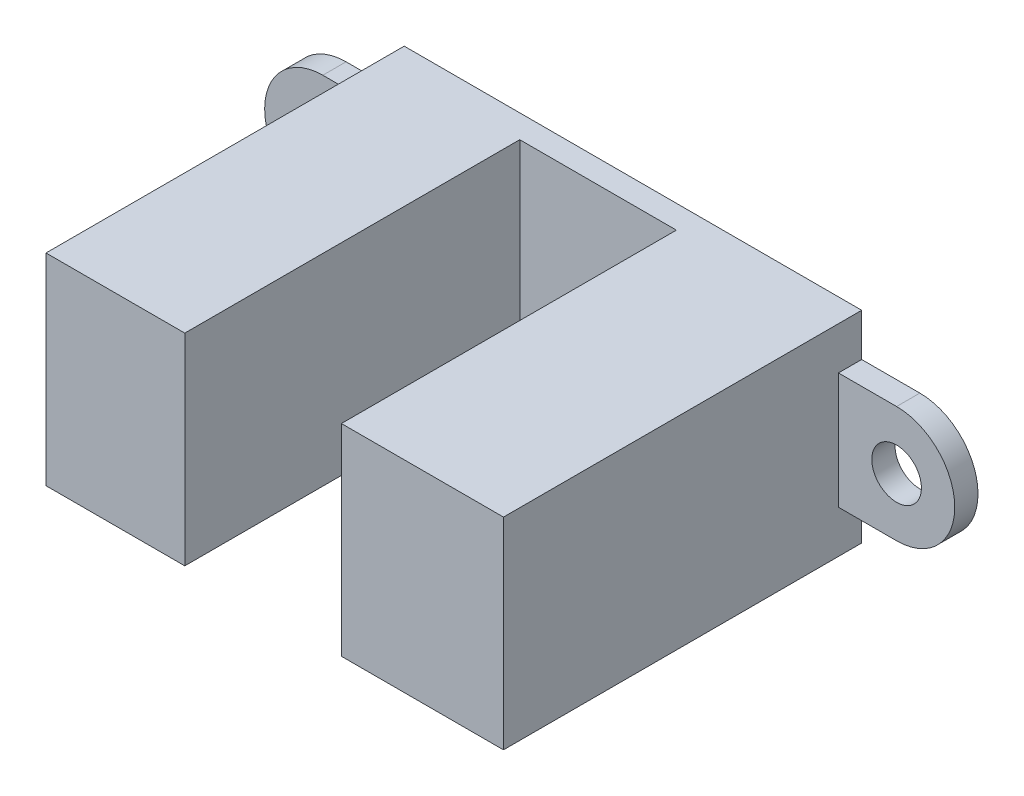
ISO-10303-21;
HEADER;
FILE_DESCRIPTION(('STEP AP214'),'2;1');
FILE_NAME('part.step','',(''),(''),'','','');
FILE_SCHEMA(('AUTOMOTIVE_DESIGN { 1 0 10303 214 1 1 1 1 }'));
ENDSEC;
DATA;
#1=APPLICATION_CONTEXT('core data for automotive mechanical design processes');
#2=APPLICATION_PROTOCOL_DEFINITION('international standard','automotive_design',2000,#1);
#3=PRODUCT_CONTEXT('',#1,'mechanical');
#4=PRODUCT('Part','Part','',(#3));
#5=PRODUCT_RELATED_PRODUCT_CATEGORY('part','',(#4));
#6=PRODUCT_DEFINITION_FORMATION('','',#4);
#7=PRODUCT_DEFINITION_CONTEXT('part definition',#1,'design');
#8=PRODUCT_DEFINITION('design','',#6,#7);
#9=PRODUCT_DEFINITION_SHAPE('','',#8);
#10=(LENGTH_UNIT() NAMED_UNIT(*) SI_UNIT(.MILLI.,.METRE.));
#11=(NAMED_UNIT(*) PLANE_ANGLE_UNIT() SI_UNIT($,.RADIAN.));
#12=(NAMED_UNIT(*) SI_UNIT($,.STERADIAN.) SOLID_ANGLE_UNIT());
#13=UNCERTAINTY_MEASURE_WITH_UNIT(LENGTH_MEASURE(1.E-05),#10,'distance_accuracy_value','');
#14=(GEOMETRIC_REPRESENTATION_CONTEXT(3) GLOBAL_UNCERTAINTY_ASSIGNED_CONTEXT((#13)) GLOBAL_UNIT_ASSIGNED_CONTEXT((#10,
#11,#12)) REPRESENTATION_CONTEXT('',''));
#15=CARTESIAN_POINT('',(0.,0.,0.));
#16=DIRECTION('',(0.,0.,1.));
#17=DIRECTION('',(1.,0.,0.));
#18=AXIS2_PLACEMENT_3D('',#15,#16,#17);
#19=CARTESIAN_POINT('',(0.,0.,1.5));
#20=DIRECTION('',(0.,0.,0.999999999999993));
#21=DIRECTION('',(1.,0.,0.));
#22=AXIS2_PLACEMENT_3D('',#19,#20,#21);
#23=PLANE('',#22);
#24=DIRECTION('',(1.,0.,0.));
#25=VECTOR('',#24,1.);
#26=CARTESIAN_POINT('',(0.,6.49999999999979,1.5));
#27=LINE('',#26,#25);
#28=CARTESIAN_POINT('',(-5.8,6.49999999999979,1.5));
#29=VERTEX_POINT('',#28);
#30=CARTESIAN_POINT('',(4.3,6.49999999999979,1.49999999999997));
#31=VERTEX_POINT('',#30);
#32=EDGE_CURVE('E52',#29,#31,#27,.T.);
#33=ORIENTED_EDGE('',*,*,#32,.F.);
#34=DIRECTION('',(0.,-0.999999999999997,0.));
#35=VECTOR('',#34,1.);
#36=CARTESIAN_POINT('',(-5.8,0.,1.5));
#37=LINE('',#36,#35);
#38=CARTESIAN_POINT('',(-5.8,-6.5,1.49999999999997));
#39=VERTEX_POINT('',#38);
#40=EDGE_CURVE('E157',#29,#39,#37,.T.);
#41=ORIENTED_EDGE('',*,*,#40,.T.);
#42=DIRECTION('',(1.,0.,0.));
#43=VECTOR('',#42,1.);
#44=CARTESIAN_POINT('',(0.,-6.5,1.49999999999997));
#45=LINE('',#44,#43);
#46=CARTESIAN_POINT('',(4.3,-6.5,1.49999999999997));
#47=VERTEX_POINT('',#46);
#48=EDGE_CURVE('E288',#39,#47,#45,.T.);
#49=ORIENTED_EDGE('',*,*,#48,.T.);
#50=DIRECTION('',(0.,0.999999999999997,0.));
#51=VECTOR('',#50,1.);
#52=CARTESIAN_POINT('',(4.3,0.,1.5));
#53=LINE('',#52,#51);
#54=EDGE_CURVE('E175',#47,#31,#53,.T.);
#55=ORIENTED_EDGE('',*,*,#54,.T.);
#56=EDGE_LOOP('',(#33,#41,#49,#55));
#57=FACE_BOUND('',#56,.T.);
#58=ADVANCED_FACE('F36',(#57),#23,.T.);
#59=CARTESIAN_POINT('',(-18.5,0.,1.50000000000003));
#60=DIRECTION('',(0.,0.,0.999999999999993));
#61=DIRECTION('',(1.,0.,0.));
#62=AXIS2_PLACEMENT_3D('',#59,#60,#61);
#63=CIRCLE('',#62,1.6);
#64=CARTESIAN_POINT('',(-20.1,0.,1.50000000000002));
#65=VERTEX_POINT('',#64);
#66=EDGE_CURVE('E264',#65,#65,#63,.T.);
#67=ORIENTED_EDGE('',*,*,#66,.F.);
#68=EDGE_LOOP('',(#67));
#69=FACE_BOUND('',#68,.T.);
#70=DIRECTION('',(0.,-0.999999999999997,0.));
#71=VECTOR('',#70,1.);
#72=CARTESIAN_POINT('',(-14.75,0.,1.5));
#73=LINE('',#72,#71);
#74=CARTESIAN_POINT('',(-14.75,3.74999999999979,1.5));
#75=VERTEX_POINT('',#74);
#76=CARTESIAN_POINT('',(-14.75,-3.75,1.5));
#77=VERTEX_POINT('',#76);
#78=EDGE_CURVE('E262',#75,#77,#73,.T.);
#79=ORIENTED_EDGE('',*,*,#78,.F.);
#80=DIRECTION('',(-1.,0.,0.));
#81=VECTOR('',#80,1.);
#82=CARTESIAN_POINT('',(0.,3.74999999999979,1.5));
#83=LINE('',#82,#81);
#84=CARTESIAN_POINT('',(-18.5,3.74999999999979,1.50000000000003));
#85=VERTEX_POINT('',#84);
#86=EDGE_CURVE('E61',#75,#85,#83,.T.);
#87=ORIENTED_EDGE('',*,*,#86,.T.);
#88=CARTESIAN_POINT('',(-18.5,0.,1.50000000000003));
#89=DIRECTION('',(0.,0.,0.999999999999993));
#90=DIRECTION('',(1.,0.,0.));
#91=AXIS2_PLACEMENT_3D('',#88,#89,#90);
#92=CIRCLE('',#91,3.75);
#93=CARTESIAN_POINT('',(-18.5,-3.75,1.50000000000003));
#94=VERTEX_POINT('',#93);
#95=EDGE_CURVE('E213',#94,#85,#92,.F.);
#96=ORIENTED_EDGE('',*,*,#95,.F.);
#97=DIRECTION('',(-1.,0.,0.));
#98=VECTOR('',#97,1.);
#99=CARTESIAN_POINT('',(0.,-3.75,1.5));
#100=LINE('',#99,#98);
#101=EDGE_CURVE('E244',#77,#94,#100,.T.);
#102=ORIENTED_EDGE('',*,*,#101,.F.);
#103=EDGE_LOOP('',(#79,#87,#96,#102));
#104=FACE_BOUND('',#103,.T.);
#105=ADVANCED_FACE('F327',(#69,#104),#23,.T.);
#106=CARTESIAN_POINT('',(-18.5,0.,1.50000000000003));
#107=DIRECTION('',(0.,0.,-0.999999999999993));
#108=DIRECTION('',(-1.,0.,0.));
#109=AXIS2_PLACEMENT_3D('',#106,#107,#108);
#110=CYLINDRICAL_SURFACE('',#109,3.75);
#111=CARTESIAN_POINT('',(-18.5,0.,0.));
#112=DIRECTION('',(0.,0.,0.999999999999993));
#113=DIRECTION('',(1.,0.,0.));
#114=AXIS2_PLACEMENT_3D('',#111,#112,#113);
#115=CIRCLE('',#114,3.75);
#116=CARTESIAN_POINT('',(-18.5,-3.75,0.));
#117=VERTEX_POINT('',#116);
#118=CARTESIAN_POINT('',(-18.5,3.74999999999979,0.));
#119=VERTEX_POINT('',#118);
#120=EDGE_CURVE('E184',#117,#119,#115,.F.);
#121=ORIENTED_EDGE('',*,*,#120,.F.);
#122=DIRECTION('',(0.,0.,-0.999999999999993));
#123=VECTOR('',#122,1.);
#124=CARTESIAN_POINT('',(-18.5,-3.75,1.50000000000003));
#125=LINE('',#124,#123);
#126=EDGE_CURVE('E40',#94,#117,#125,.T.);
#127=ORIENTED_EDGE('',*,*,#126,.F.);
#128=ORIENTED_EDGE('',*,*,#95,.T.);
#129=DIRECTION('',(0.,0.,-0.999999999999993));
#130=VECTOR('',#129,1.);
#131=CARTESIAN_POINT('',(-18.5,3.74999999999979,1.50000000000003));
#132=LINE('',#131,#130);
#133=EDGE_CURVE('E107',#85,#119,#132,.T.);
#134=ORIENTED_EDGE('',*,*,#133,.T.);
#135=EDGE_LOOP('',(#121,#127,#128,#134));
#136=FACE_BOUND('',#135,.T.);
#137=ADVANCED_FACE('F38',(#136),#110,.T.);
#138=CARTESIAN_POINT('',(0.,-3.75,1.5));
#139=DIRECTION('',(0.,-0.999999999999997,0.));
#140=DIRECTION('',(0.,0.,-0.999999999999993));
#141=AXIS2_PLACEMENT_3D('',#138,#139,#140);
#142=PLANE('',#141);
#143=DIRECTION('',(-1.,0.,0.));
#144=VECTOR('',#143,1.);
#145=CARTESIAN_POINT('',(0.,-3.75,0.));
#146=LINE('',#145,#144);
#147=CARTESIAN_POINT('',(-14.75,-3.75,0.));
#148=VERTEX_POINT('',#147);
#149=EDGE_CURVE('E187',#148,#117,#146,.T.);
#150=ORIENTED_EDGE('',*,*,#149,.F.);
#151=DIRECTION('',(0.,0.,-0.999999999999993));
#152=VECTOR('',#151,1.);
#153=CARTESIAN_POINT('',(-14.75,-3.75,1.5));
#154=LINE('',#153,#152);
#155=EDGE_CURVE('E235',#77,#148,#154,.T.);
#156=ORIENTED_EDGE('',*,*,#155,.F.);
#157=ORIENTED_EDGE('',*,*,#101,.T.);
#158=ORIENTED_EDGE('',*,*,#126,.T.);
#159=EDGE_LOOP('',(#150,#156,#157,#158));
#160=FACE_BOUND('',#159,.T.);
#161=ADVANCED_FACE('F242',(#160),#142,.T.);
#162=CARTESIAN_POINT('',(0.,-6.5,1.49999999999997));
#163=DIRECTION('',(0.,0.999999999999997,0.));
#164=DIRECTION('',(0.,0.,0.999999999999993));
#165=AXIS2_PLACEMENT_3D('',#162,#163,#164);
#166=PLANE('',#165);
#167=DIRECTION('',(1.,0.,0.));
#168=VECTOR('',#167,1.);
#169=CARTESIAN_POINT('',(0.,-6.5,0.));
#170=LINE('',#169,#168);
#171=CARTESIAN_POINT('',(-14.75,-6.5,0.));
#172=VERTEX_POINT('',#171);
#173=CARTESIAN_POINT('',(14.75,-6.5,0.));
#174=VERTEX_POINT('',#173);
#175=EDGE_CURVE('E194',#172,#174,#170,.T.);
#176=ORIENTED_EDGE('',*,*,#175,.T.);
#177=DIRECTION('',(0.,0.,-0.999999999999993));
#178=VECTOR('',#177,1.);
#179=CARTESIAN_POINT('',(14.75,-6.5,1.49999999999995));
#180=LINE('',#179,#178);
#181=CARTESIAN_POINT('',(14.75,-6.50000000000001,23.0999999999998));
#182=VERTEX_POINT('',#181);
#183=EDGE_CURVE('E231',#182,#174,#180,.T.);
#184=ORIENTED_EDGE('',*,*,#183,.F.);
#185=DIRECTION('',(1.,0.,0.));
#186=VECTOR('',#185,1.);
#187=CARTESIAN_POINT('',(4.29999999999999,-6.50000000000001,23.0999999999999));
#188=LINE('',#187,#186);
#189=CARTESIAN_POINT('',(4.29999999999999,-6.50000000000001,23.0999999999999));
#190=VERTEX_POINT('',#189);
#191=EDGE_CURVE('E188',#190,#182,#188,.T.);
#192=ORIENTED_EDGE('',*,*,#191,.F.);
#193=DIRECTION('',(0.,0.,-0.999999999999993));
#194=VECTOR('',#193,1.);
#195=CARTESIAN_POINT('',(4.3,-6.5,1.49999999999997));
#196=LINE('',#195,#194);
#197=EDGE_CURVE('E270',#190,#47,#196,.T.);
#198=ORIENTED_EDGE('',*,*,#197,.T.);
#199=ORIENTED_EDGE('',*,*,#48,.F.);
#200=DIRECTION('',(0.,0.,0.999999999999993));
#201=VECTOR('',#200,1.);
#202=CARTESIAN_POINT('',(-5.8,-6.5,1.49999999999997));
#203=LINE('',#202,#201);
#204=CARTESIAN_POINT('',(-5.80000000000001,-6.50000000000001,23.0999999999999));
#205=VERTEX_POINT('',#204);
#206=EDGE_CURVE('E163',#39,#205,#203,.T.);
#207=ORIENTED_EDGE('',*,*,#206,.T.);
#208=DIRECTION('',(-1.,0.,0.));
#209=VECTOR('',#208,1.);
#210=CARTESIAN_POINT('',(-5.80000000000001,-6.50000000000001,23.0999999999999));
#211=LINE('',#210,#209);
#212=CARTESIAN_POINT('',(-14.75,-6.50000000000001,23.0999999999999));
#213=VERTEX_POINT('',#212);
#214=EDGE_CURVE('E256',#205,#213,#211,.T.);
#215=ORIENTED_EDGE('',*,*,#214,.T.);
#216=DIRECTION('',(0.,0.,-0.999999999999993));
#217=VECTOR('',#216,1.);
#218=CARTESIAN_POINT('',(-14.75,-6.5,1.5));
#219=LINE('',#218,#217);
#220=EDGE_CURVE('E234',#213,#172,#219,.T.);
#221=ORIENTED_EDGE('',*,*,#220,.T.);
#222=EDGE_LOOP('',(#176,#184,#192,#198,#199,#207,#215,#221));
#223=FACE_BOUND('',#222,.T.);
#224=ADVANCED_FACE('F257',(#223),#166,.F.);
#225=CARTESIAN_POINT('',(0.,-3.75,1.5));
#226=DIRECTION('',(0.,0.999999999999997,0.));
#227=DIRECTION('',(0.,0.,0.999999999999993));
#228=AXIS2_PLACEMENT_3D('',#225,#226,#227);
#229=PLANE('',#228);
#230=DIRECTION('',(1.,0.,0.));
#231=VECTOR('',#230,1.);
#232=CARTESIAN_POINT('',(0.,-3.75,0.));
#233=LINE('',#232,#231);
#234=CARTESIAN_POINT('',(14.75,-3.75,0.));
#235=VERTEX_POINT('',#234);
#236=CARTESIAN_POINT('',(18.5,-3.75,0.));
#237=VERTEX_POINT('',#236);
#238=EDGE_CURVE('E199',#235,#237,#233,.T.);
#239=ORIENTED_EDGE('',*,*,#238,.T.);
#240=DIRECTION('',(0.,0.,-0.999999999999993));
#241=VECTOR('',#240,1.);
#242=CARTESIAN_POINT('',(18.5,-3.75,1.5));
#243=LINE('',#242,#241);
#244=CARTESIAN_POINT('',(18.5,-3.75,1.5));
#245=VERTEX_POINT('',#244);
#246=EDGE_CURVE('E225',#245,#237,#243,.T.);
#247=ORIENTED_EDGE('',*,*,#246,.F.);
#248=DIRECTION('',(1.,0.,0.));
#249=VECTOR('',#248,1.);
#250=CARTESIAN_POINT('',(0.,-3.75,1.5));
#251=LINE('',#250,#249);
#252=CARTESIAN_POINT('',(14.75,-3.75,1.49999999999997));
#253=VERTEX_POINT('',#252);
#254=EDGE_CURVE('E290',#253,#245,#251,.T.);
#255=ORIENTED_EDGE('',*,*,#254,.F.);
#256=DIRECTION('',(0.,0.,-0.999999999999993));
#257=VECTOR('',#256,1.);
#258=CARTESIAN_POINT('',(14.75,-3.75,1.49999999999997));
#259=LINE('',#258,#257);
#260=EDGE_CURVE('E228',#253,#235,#259,.T.);
#261=ORIENTED_EDGE('',*,*,#260,.T.);
#262=EDGE_LOOP('',(#239,#247,#255,#261));
#263=FACE_BOUND('',#262,.T.);
#264=ADVANCED_FACE('F410',(#263),#229,.F.);
#265=CARTESIAN_POINT('',(18.5,0.,1.5));
#266=DIRECTION('',(0.,0.,-0.999999999999993));
#267=DIRECTION('',(-1.,0.,0.));
#268=AXIS2_PLACEMENT_3D('',#265,#266,#267);
#269=CYLINDRICAL_SURFACE('',#268,3.75);
#270=CARTESIAN_POINT('',(18.5,0.,0.));
#271=DIRECTION('',(0.,0.,0.999999999999993));
#272=DIRECTION('',(1.,0.,0.));
#273=AXIS2_PLACEMENT_3D('',#270,#271,#272);
#274=CIRCLE('',#273,3.75);
#275=CARTESIAN_POINT('',(18.5,3.74999999999979,0.));
#276=VERTEX_POINT('',#275);
#277=EDGE_CURVE('E202',#237,#276,#274,.T.);
#278=ORIENTED_EDGE('',*,*,#277,.T.);
#279=DIRECTION('',(0.,0.,-0.999999999999993));
#280=VECTOR('',#279,1.);
#281=CARTESIAN_POINT('',(18.5,3.74999999999979,1.5));
#282=LINE('',#281,#280);
#283=CARTESIAN_POINT('',(18.5,3.74999999999979,1.5));
#284=VERTEX_POINT('',#283);
#285=EDGE_CURVE('E223',#284,#276,#282,.T.);
#286=ORIENTED_EDGE('',*,*,#285,.F.);
#287=CARTESIAN_POINT('',(18.5,0.,1.5));
#288=DIRECTION('',(0.,0.,0.999999999999993));
#289=DIRECTION('',(1.,0.,0.));
#290=AXIS2_PLACEMENT_3D('',#287,#288,#289);
#291=CIRCLE('',#290,3.75);
#292=EDGE_CURVE('E180',#245,#284,#291,.T.);
#293=ORIENTED_EDGE('',*,*,#292,.F.);
#294=ORIENTED_EDGE('',*,*,#246,.T.);
#295=EDGE_LOOP('',(#278,#286,#293,#294));
#296=FACE_BOUND('',#295,.T.);
#297=ADVANCED_FACE('F299',(#296),#269,.T.);
#298=CARTESIAN_POINT('',(0.,3.74999999999979,1.5));
#299=DIRECTION('',(0.,0.999999999999997,0.));
#300=DIRECTION('',(0.,0.,0.999999999999993));
#301=AXIS2_PLACEMENT_3D('',#298,#299,#300);
#302=PLANE('',#301);
#303=DIRECTION('',(1.,0.,0.));
#304=VECTOR('',#303,1.);
#305=CARTESIAN_POINT('',(0.,3.74999999999979,0.));
#306=LINE('',#305,#304);
#307=CARTESIAN_POINT('',(14.75,3.74999999999979,0.));
#308=VERTEX_POINT('',#307);
#309=EDGE_CURVE('E205',#308,#276,#306,.T.);
#310=ORIENTED_EDGE('',*,*,#309,.F.);
#311=DIRECTION('',(0.,0.,-0.999999999999993));
#312=VECTOR('',#311,1.);
#313=CARTESIAN_POINT('',(14.75,3.74999999999979,1.49999999999997));
#314=LINE('',#313,#312);
#315=CARTESIAN_POINT('',(14.75,3.74999999999979,1.49999999999998));
#316=VERTEX_POINT('',#315);
#317=EDGE_CURVE('E221',#316,#308,#314,.T.);
#318=ORIENTED_EDGE('',*,*,#317,.F.);
#319=DIRECTION('',(1.,0.,0.));
#320=VECTOR('',#319,1.);
#321=CARTESIAN_POINT('',(0.,3.74999999999979,1.5));
#322=LINE('',#321,#320);
#323=EDGE_CURVE('E176',#316,#284,#322,.T.);
#324=ORIENTED_EDGE('',*,*,#323,.T.);
#325=ORIENTED_EDGE('',*,*,#285,.T.);
#326=EDGE_LOOP('',(#310,#318,#324,#325));
#327=FACE_BOUND('',#326,.T.);
#328=ADVANCED_FACE('F304',(#327),#302,.T.);
#329=CARTESIAN_POINT('',(14.75,0.,1.49999999999997));
#330=DIRECTION('',(-1.,0.,0.));
#331=DIRECTION('',(0.,0.,0.999999999999993));
#332=AXIS2_PLACEMENT_3D('',#329,#330,#331);
#333=PLANE('',#332);
#334=DIRECTION('',(0.,0.999999999999997,0.));
#335=VECTOR('',#334,1.);
#336=CARTESIAN_POINT('',(14.75,0.,0.));
#337=LINE('',#336,#335);
#338=CARTESIAN_POINT('',(14.75,6.49999999999979,0.));
#339=VERTEX_POINT('',#338);
#340=EDGE_CURVE('E200',#308,#339,#337,.T.);
#341=ORIENTED_EDGE('',*,*,#340,.T.);
#342=DIRECTION('',(0.,0.,-0.999999999999993));
#343=VECTOR('',#342,1.);
#344=CARTESIAN_POINT('',(14.75,6.49999999999979,1.49999999999997));
#345=LINE('',#344,#343);
#346=CARTESIAN_POINT('',(14.75,6.49999999999979,23.0999999999998));
#347=VERTEX_POINT('',#346);
#348=EDGE_CURVE('E219',#347,#339,#345,.T.);
#349=ORIENTED_EDGE('',*,*,#348,.F.);
#350=DIRECTION('',(0.,-0.999999999999997,0.));
#351=VECTOR('',#350,1.);
#352=CARTESIAN_POINT('',(14.75,0.,23.0999999999998));
#353=LINE('',#352,#351);
#354=EDGE_CURVE('E268',#347,#182,#353,.T.);
#355=ORIENTED_EDGE('',*,*,#354,.T.);
#356=ORIENTED_EDGE('',*,*,#183,.T.);
#357=EDGE_CURVE('E197',#174,#235,#337,.T.);
#358=ORIENTED_EDGE('',*,*,#357,.T.);
#359=ORIENTED_EDGE('',*,*,#260,.F.);
#360=DIRECTION('',(0.,0.999999999999997,0.));
#361=VECTOR('',#360,1.);
#362=CARTESIAN_POINT('',(14.75,0.,1.49999999999997));
#363=LINE('',#362,#361);
#364=EDGE_CURVE('E11',#253,#316,#363,.T.);
#365=ORIENTED_EDGE('',*,*,#364,.T.);
#366=ORIENTED_EDGE('',*,*,#317,.T.);
#367=EDGE_LOOP('',(#341,#349,#355,#356,#358,#359,#365,#366));
#368=FACE_BOUND('',#367,.T.);
#369=ADVANCED_FACE('F308',(#368),#333,.F.);
#370=CARTESIAN_POINT('',(0.,6.49999999999979,1.5));
#371=DIRECTION('',(0.,0.999999999999997,0.));
#372=DIRECTION('',(0.,0.,0.999999999999993));
#373=AXIS2_PLACEMENT_3D('',#370,#371,#372);
#374=PLANE('',#373);
#375=DIRECTION('',(1.,0.,0.));
#376=VECTOR('',#375,1.);
#377=CARTESIAN_POINT('',(0.,6.49999999999979,0.));
#378=LINE('',#377,#376);
#379=CARTESIAN_POINT('',(-14.75,6.49999999999979,0.));
#380=VERTEX_POINT('',#379);
#381=EDGE_CURVE('E208',#380,#339,#378,.T.);
#382=ORIENTED_EDGE('',*,*,#381,.F.);
#383=DIRECTION('',(0.,0.,-0.999999999999993));
#384=VECTOR('',#383,1.);
#385=CARTESIAN_POINT('',(-14.75,6.49999999999979,1.5));
#386=LINE('',#385,#384);
#387=CARTESIAN_POINT('',(-14.75,6.49999999999979,23.0999999999999));
#388=VERTEX_POINT('',#387);
#389=EDGE_CURVE('E217',#388,#380,#386,.T.);
#390=ORIENTED_EDGE('',*,*,#389,.F.);
#391=DIRECTION('',(-1.,0.,0.));
#392=VECTOR('',#391,1.);
#393=CARTESIAN_POINT('',(-5.80000000000001,6.49999999999979,23.0999999999998));
#394=LINE('',#393,#392);
#395=CARTESIAN_POINT('',(-5.80000000000001,6.49999999999979,23.0999999999998));
#396=VERTEX_POINT('',#395);
#397=EDGE_CURVE('E170',#396,#388,#394,.T.);
#398=ORIENTED_EDGE('',*,*,#397,.F.);
#399=DIRECTION('',(0.,0.,-0.999999999999993));
#400=VECTOR('',#399,1.);
#401=CARTESIAN_POINT('',(-5.8,6.49999999999979,1.5));
#402=LINE('',#401,#400);
#403=EDGE_CURVE('E160',#396,#29,#402,.T.);
#404=ORIENTED_EDGE('',*,*,#403,.T.);
#405=ORIENTED_EDGE('',*,*,#32,.T.);
#406=DIRECTION('',(0.,0.,0.999999999999993));
#407=VECTOR('',#406,1.);
#408=CARTESIAN_POINT('',(4.3,6.49999999999979,1.49999999999998));
#409=LINE('',#408,#407);
#410=CARTESIAN_POINT('',(4.29999999999999,6.49999999999979,23.0999999999999));
#411=VERTEX_POINT('',#410);
#412=EDGE_CURVE('E274',#31,#411,#409,.T.);
#413=ORIENTED_EDGE('',*,*,#412,.T.);
#414=DIRECTION('',(1.,0.,0.));
#415=VECTOR('',#414,1.);
#416=CARTESIAN_POINT('',(4.29999999999999,6.49999999999979,23.0999999999999));
#417=LINE('',#416,#415);
#418=EDGE_CURVE('E278',#411,#347,#417,.T.);
#419=ORIENTED_EDGE('',*,*,#418,.T.);
#420=ORIENTED_EDGE('',*,*,#348,.T.);
#421=EDGE_LOOP('',(#382,#390,#398,#404,#405,#413,#419,#420));
#422=FACE_BOUND('',#421,.T.);
#423=ADVANCED_FACE('F168',(#422),#374,.T.);
#424=CARTESIAN_POINT('',(-14.75,0.,1.5));
#425=DIRECTION('',(-1.,0.,0.));
#426=DIRECTION('',(0.,0.,0.999999999999993));
#427=AXIS2_PLACEMENT_3D('',#424,#425,#426);
#428=PLANE('',#427);
#429=DIRECTION('',(0.,0.999999999999997,0.));
#430=VECTOR('',#429,1.);
#431=CARTESIAN_POINT('',(-14.75,0.,0.));
#432=LINE('',#431,#430);
#433=CARTESIAN_POINT('',(-14.75,3.74999999999979,0.));
#434=VERTEX_POINT('',#433);
#435=EDGE_CURVE('E195',#434,#380,#432,.T.);
#436=ORIENTED_EDGE('',*,*,#435,.F.);
#437=DIRECTION('',(0.,0.,-0.999999999999993));
#438=VECTOR('',#437,1.);
#439=CARTESIAN_POINT('',(-14.75,3.74999999999979,1.5));
#440=LINE('',#439,#438);
#441=EDGE_CURVE('E215',#75,#434,#440,.T.);
#442=ORIENTED_EDGE('',*,*,#441,.F.);
#443=ORIENTED_EDGE('',*,*,#78,.T.);
#444=ORIENTED_EDGE('',*,*,#155,.T.);
#445=EDGE_CURVE('E191',#172,#148,#432,.T.);
#446=ORIENTED_EDGE('',*,*,#445,.F.);
#447=ORIENTED_EDGE('',*,*,#220,.F.);
#448=DIRECTION('',(0.,0.999999999999997,0.));
#449=VECTOR('',#448,1.);
#450=CARTESIAN_POINT('',(-14.75,-1.04083408558608E-13,23.0999999999999));
#451=LINE('',#450,#449);
#452=EDGE_CURVE('E171',#213,#388,#451,.T.);
#453=ORIENTED_EDGE('',*,*,#452,.T.);
#454=ORIENTED_EDGE('',*,*,#389,.T.);
#455=EDGE_LOOP('',(#436,#442,#443,#444,#446,#447,#453,#454));
#456=FACE_BOUND('',#455,.T.);
#457=ADVANCED_FACE('F251',(#456),#428,.T.);
#458=CARTESIAN_POINT('',(0.,3.74999999999979,1.5));
#459=DIRECTION('',(0.,-0.999999999999997,0.));
#460=DIRECTION('',(0.,0.,-0.999999999999993));
#461=AXIS2_PLACEMENT_3D('',#458,#459,#460);
#462=PLANE('',#461);
#463=DIRECTION('',(-1.,0.,0.));
#464=VECTOR('',#463,1.);
#465=CARTESIAN_POINT('',(0.,3.74999999999979,0.));
#466=LINE('',#465,#464);
#467=EDGE_CURVE('E211',#434,#119,#466,.T.);
#468=ORIENTED_EDGE('',*,*,#467,.T.);
#469=ORIENTED_EDGE('',*,*,#133,.F.);
#470=ORIENTED_EDGE('',*,*,#86,.F.);
#471=ORIENTED_EDGE('',*,*,#441,.T.);
#472=EDGE_LOOP('',(#468,#469,#470,#471));
#473=FACE_BOUND('',#472,.T.);
#474=ADVANCED_FACE('F335',(#473),#462,.F.);
#475=CARTESIAN_POINT('',(18.5,0.,1.5));
#476=DIRECTION('',(0.,0.,0.999999999999993));
#477=DIRECTION('',(1.,0.,0.));
#478=AXIS2_PLACEMENT_3D('',#475,#476,#477);
#479=CIRCLE('',#478,1.6);
#480=CARTESIAN_POINT('',(16.9,0.,1.5));
#481=VERTEX_POINT('',#480);
#482=EDGE_CURVE('E346',#481,#481,#479,.T.);
#483=ORIENTED_EDGE('',*,*,#482,.F.);
#484=EDGE_LOOP('',(#483));
#485=FACE_BOUND('',#484,.T.);
#486=ORIENTED_EDGE('',*,*,#364,.F.);
#487=ORIENTED_EDGE('',*,*,#254,.T.);
#488=ORIENTED_EDGE('',*,*,#292,.T.);
#489=ORIENTED_EDGE('',*,*,#323,.F.);
#490=EDGE_LOOP('',(#486,#487,#488,#489));
#491=FACE_BOUND('',#490,.T.);
#492=ADVANCED_FACE('F295',(#485,#491),#23,.T.);
#493=CARTESIAN_POINT('',(0.,0.,0.));
#494=DIRECTION('',(0.,0.,0.999999999999993));
#495=DIRECTION('',(1.,0.,0.));
#496=AXIS2_PLACEMENT_3D('',#493,#494,#495);
#497=PLANE('',#496);
#498=CARTESIAN_POINT('',(18.5,0.,0.));
#499=DIRECTION('',(0.,0.,-0.999999999999993));
#500=DIRECTION('',(-1.,0.,0.));
#501=AXIS2_PLACEMENT_3D('',#498,#499,#500);
#502=CIRCLE('',#501,1.6);
#503=CARTESIAN_POINT('',(16.9,0.,0.));
#504=VERTEX_POINT('',#503);
#505=EDGE_CURVE('E349',#504,#504,#502,.T.);
#506=ORIENTED_EDGE('',*,*,#505,.F.);
#507=EDGE_LOOP('',(#506));
#508=FACE_BOUND('',#507,.T.);
#509=CARTESIAN_POINT('',(-18.5,0.,0.));
#510=DIRECTION('',(0.,0.,-0.999999999999993));
#511=DIRECTION('',(-1.,0.,0.));
#512=AXIS2_PLACEMENT_3D('',#509,#510,#511);
#513=CIRCLE('',#512,1.6);
#514=CARTESIAN_POINT('',(-20.1,0.,0.));
#515=VERTEX_POINT('',#514);
#516=EDGE_CURVE('E348',#515,#515,#513,.T.);
#517=ORIENTED_EDGE('',*,*,#516,.F.);
#518=EDGE_LOOP('',(#517));
#519=FACE_BOUND('',#518,.T.);
#520=ORIENTED_EDGE('',*,*,#120,.T.);
#521=ORIENTED_EDGE('',*,*,#467,.F.);
#522=ORIENTED_EDGE('',*,*,#435,.T.);
#523=ORIENTED_EDGE('',*,*,#381,.T.);
#524=ORIENTED_EDGE('',*,*,#340,.F.);
#525=ORIENTED_EDGE('',*,*,#309,.T.);
#526=ORIENTED_EDGE('',*,*,#277,.F.);
#527=ORIENTED_EDGE('',*,*,#238,.F.);
#528=ORIENTED_EDGE('',*,*,#357,.F.);
#529=ORIENTED_EDGE('',*,*,#175,.F.);
#530=ORIENTED_EDGE('',*,*,#445,.T.);
#531=ORIENTED_EDGE('',*,*,#149,.T.);
#532=EDGE_LOOP('',(#520,#521,#522,#523,#524,#525,#526,#527,#528,#529,#530,#531));
#533=FACE_BOUND('',#532,.T.);
#534=ADVANCED_FACE('F247',(#508,#519,#533),#497,.F.);
#535=CARTESIAN_POINT('',(4.29999999999999,0.,23.0999999999998));
#536=DIRECTION('',(0.,0.,0.999999999999993));
#537=DIRECTION('',(1.,0.,0.));
#538=AXIS2_PLACEMENT_3D('',#535,#536,#537);
#539=PLANE('',#538);
#540=ORIENTED_EDGE('',*,*,#354,.F.);
#541=ORIENTED_EDGE('',*,*,#418,.F.);
#542=DIRECTION('',(0.,-0.999999999999997,0.));
#543=VECTOR('',#542,1.);
#544=CARTESIAN_POINT('',(4.29999999999999,0.,23.0999999999998));
#545=LINE('',#544,#543);
#546=EDGE_CURVE('E276',#411,#190,#545,.T.);
#547=ORIENTED_EDGE('',*,*,#546,.T.);
#548=ORIENTED_EDGE('',*,*,#191,.T.);
#549=EDGE_LOOP('',(#540,#541,#547,#548));
#550=FACE_BOUND('',#549,.T.);
#551=ADVANCED_FACE('F313',(#550),#539,.T.);
#552=CARTESIAN_POINT('',(4.3,0.,0.));
#553=DIRECTION('',(1.,0.,0.));
#554=DIRECTION('',(0.,0.,-0.999999999999993));
#555=AXIS2_PLACEMENT_3D('',#552,#553,#554);
#556=PLANE('',#555);
#557=ORIENTED_EDGE('',*,*,#197,.F.);
#558=ORIENTED_EDGE('',*,*,#546,.F.);
#559=ORIENTED_EDGE('',*,*,#412,.F.);
#560=ORIENTED_EDGE('',*,*,#54,.F.);
#561=EDGE_LOOP('',(#557,#558,#559,#560));
#562=FACE_BOUND('',#561,.T.);
#563=ADVANCED_FACE('F317',(#562),#556,.F.);
#564=CARTESIAN_POINT('',(-5.80000000000001,-1.04083408558608E-13,23.0999999999998));
#565=DIRECTION('',(0.,0.,0.999999999999993));
#566=DIRECTION('',(1.,0.,0.));
#567=AXIS2_PLACEMENT_3D('',#564,#565,#566);
#568=PLANE('',#567);
#569=ORIENTED_EDGE('',*,*,#452,.F.);
#570=ORIENTED_EDGE('',*,*,#214,.F.);
#571=DIRECTION('',(0.,0.999999999999997,0.));
#572=VECTOR('',#571,1.);
#573=CARTESIAN_POINT('',(-5.80000000000001,-1.04083408558608E-13,23.0999999999998));
#574=LINE('',#573,#572);
#575=EDGE_CURVE('E259',#205,#396,#574,.T.);
#576=ORIENTED_EDGE('',*,*,#575,.T.);
#577=ORIENTED_EDGE('',*,*,#397,.T.);
#578=EDGE_LOOP('',(#569,#570,#576,#577));
#579=FACE_BOUND('',#578,.T.);
#580=ADVANCED_FACE('F261',(#579),#568,.T.);
#581=CARTESIAN_POINT('',(-5.8,0.,0.));
#582=DIRECTION('',(-1.,0.,0.));
#583=DIRECTION('',(0.,0.,0.999999999999993));
#584=AXIS2_PLACEMENT_3D('',#581,#582,#583);
#585=PLANE('',#584);
#586=ORIENTED_EDGE('',*,*,#403,.F.);
#587=ORIENTED_EDGE('',*,*,#575,.F.);
#588=ORIENTED_EDGE('',*,*,#206,.F.);
#589=ORIENTED_EDGE('',*,*,#40,.F.);
#590=EDGE_LOOP('',(#586,#587,#588,#589));
#591=FACE_BOUND('',#590,.T.);
#592=ADVANCED_FACE('F158',(#591),#585,.F.);
#593=CARTESIAN_POINT('',(-18.5,0.,0.));
#594=DIRECTION('',(0.,0.,-0.999999999999993));
#595=DIRECTION('',(-1.,0.,0.));
#596=AXIS2_PLACEMENT_3D('',#593,#594,#595);
#597=CYLINDRICAL_SURFACE('',#596,1.6);
#598=CARTESIAN_POINT('',(-20.1,0.,1.50000000000002));
#599=CARTESIAN_POINT('',(-20.1,0.,1.48437500000002));
#600=CARTESIAN_POINT('',(-20.1,0.,1.46875000000002));
#601=CARTESIAN_POINT('',(-20.1,0.,1.43750000000002));
#602=CARTESIAN_POINT('',(-20.1,0.,1.42187500000002));
#603=CARTESIAN_POINT('',(-20.1,0.,1.39062500000002));
#604=CARTESIAN_POINT('',(-20.1,0.,1.37500000000002));
#605=CARTESIAN_POINT('',(-20.1,0.,1.34375000000002));
#606=CARTESIAN_POINT('',(-20.1,0.,1.32812500000002));
#607=CARTESIAN_POINT('',(-20.1,0.,1.29687500000002));
#608=CARTESIAN_POINT('',(-20.1,0.,1.28125000000002));
#609=CARTESIAN_POINT('',(-20.1,0.,1.25000000000002));
#610=CARTESIAN_POINT('',(-20.1,0.,1.23437500000002));
#611=CARTESIAN_POINT('',(-20.1,0.,1.20312500000002));
#612=CARTESIAN_POINT('',(-20.1,0.,1.18750000000002));
#613=CARTESIAN_POINT('',(-20.1,0.,1.15625000000002));
#614=CARTESIAN_POINT('',(-20.1,0.,1.14062500000002));
#615=CARTESIAN_POINT('',(-20.1,0.,1.10937500000002));
#616=CARTESIAN_POINT('',(-20.1,0.,1.09375000000002));
#617=CARTESIAN_POINT('',(-20.1,0.,1.06250000000002));
#618=CARTESIAN_POINT('',(-20.1,0.,1.04687500000002));
#619=CARTESIAN_POINT('',(-20.1,0.,1.01562500000002));
#620=CARTESIAN_POINT('',(-20.1,0.,1.00000000000002));
#621=CARTESIAN_POINT('',(-20.1,0.,0.968750000000025));
#622=CARTESIAN_POINT('',(-20.1,0.,0.953125000000025));
#623=CARTESIAN_POINT('',(-20.1,0.,0.921875000000025));
#624=CARTESIAN_POINT('',(-20.1,0.,0.906250000000025));
#625=CARTESIAN_POINT('',(-20.1,0.,0.875000000000025));
#626=CARTESIAN_POINT('',(-20.1,0.,0.859375000000025));
#627=CARTESIAN_POINT('',(-20.1,0.,0.828125000000025));
#628=CARTESIAN_POINT('',(-20.1,0.,0.812500000000025));
#629=CARTESIAN_POINT('',(-20.1,0.,0.781250000000025));
#630=CARTESIAN_POINT('',(-20.1,0.,0.765625000000025));
#631=CARTESIAN_POINT('',(-20.1,0.,0.734375000000025));
#632=CARTESIAN_POINT('',(-20.1,0.,0.718750000000025));
#633=CARTESIAN_POINT('',(-20.1,0.,0.687500000000025));
#634=CARTESIAN_POINT('',(-20.1,0.,0.671875000000025));
#635=CARTESIAN_POINT('',(-20.1,0.,0.640625000000025));
#636=CARTESIAN_POINT('',(-20.1,0.,0.625000000000025));
#637=CARTESIAN_POINT('',(-20.1,0.,0.593750000000025));
#638=CARTESIAN_POINT('',(-20.1,0.,0.578125000000025));
#639=CARTESIAN_POINT('',(-20.1,0.,0.546875000000025));
#640=CARTESIAN_POINT('',(-20.1,0.,0.531250000000025));
#641=CARTESIAN_POINT('',(-20.1,0.,0.500000000000025));
#642=CARTESIAN_POINT('',(-20.1,0.,0.484375000000025));
#643=CARTESIAN_POINT('',(-20.1,0.,0.453125000000025));
#644=CARTESIAN_POINT('',(-20.1,0.,0.437500000000025));
#645=CARTESIAN_POINT('',(-20.1,0.,0.406250000000025));
#646=CARTESIAN_POINT('',(-20.1,0.,0.390625000000025));
#647=CARTESIAN_POINT('',(-20.1,0.,0.359375000000025));
#648=CARTESIAN_POINT('',(-20.1,0.,0.343750000000025));
#649=CARTESIAN_POINT('',(-20.1,0.,0.312500000000025));
#650=CARTESIAN_POINT('',(-20.1,0.,0.296875000000025));
#651=CARTESIAN_POINT('',(-20.1,0.,0.265625000000025));
#652=CARTESIAN_POINT('',(-20.1,0.,0.250000000000025));
#653=CARTESIAN_POINT('',(-20.1,0.,0.218750000000025));
#654=CARTESIAN_POINT('',(-20.1,0.,0.203125000000025));
#655=CARTESIAN_POINT('',(-20.1,0.,0.171875000000025));
#656=CARTESIAN_POINT('',(-20.1,0.,0.156250000000025));
#657=CARTESIAN_POINT('',(-20.1,0.,0.125000000000025));
#658=CARTESIAN_POINT('',(-20.1,0.,0.109375000000025));
#659=CARTESIAN_POINT('',(-20.1,0.,0.0781250000000247));
#660=CARTESIAN_POINT('',(-20.1,0.,0.0625000000000247));
#661=CARTESIAN_POINT('',(-20.1,0.,0.0312500000000247));
#662=CARTESIAN_POINT('',(-20.1,0.,0.0156250000000248));
#663=CARTESIAN_POINT('',(-20.1,0.,0.));
#664=B_SPLINE_CURVE_WITH_KNOTS('',3,(#598,#599,#600,#601,#602,#603,#604,#605,#606,#607,#608,
#609,#610,#611,#612,#613,#614,#615,#616,#617,#618,#619,#620,#621,#622,#623,#624,#625,#626,#627,
#628,#629,#630,#631,#632,#633,#634,#635,#636,#637,#638,#639,#640,#641,#642,#643,#644,#645,#646,
#647,#648,#649,#650,#651,#652,#653,#654,#655,#656,#657,#658,#659,#660,#661,#662,#663),
.UNSPECIFIED.,.F.,.F.,(4,2,2,2,2,2,2,2,2,2,2,2,2,2,2,2,2,2,2,2,2,2,2,2,2,2,2,2,2,2,2,2,4),(0.,
0.046875,0.0937499999999999,0.140625,0.1875,0.234375,0.28125,0.328125,0.375,0.421875,0.46875,
0.515625,0.5625,0.609375,0.65625,0.703125,0.75,0.796875,0.84375,0.890625,0.9375,0.984375,
1.03125,1.078125,1.125,1.171875,1.21875,1.265625,1.3125,1.359375,1.40625,1.453125,1.5),.UNSPECIFIED.);
#665=EDGE_CURVE('BSEAM360',#65,#515,#664,.T.);
#666=ORIENTED_EDGE('',*,*,#66,.T.);
#667=ORIENTED_EDGE('',*,*,#516,.T.);
#668=ORIENTED_EDGE('',*,*,#665,.T.);
#669=ORIENTED_EDGE('',*,*,#665,.F.);
#670=EDGE_LOOP('',(#666,#668,#667,#669));
#671=FACE_BOUND('',#670,.T.);
#672=ADVANCED_FACE('F360',(#671),#597,.F.);
#673=CARTESIAN_POINT('',(18.5,0.,0.));
#674=DIRECTION('',(0.,0.,-0.999999999999993));
#675=DIRECTION('',(-1.,0.,0.));
#676=AXIS2_PLACEMENT_3D('',#673,#674,#675);
#677=CYLINDRICAL_SURFACE('',#676,1.6);
#678=CARTESIAN_POINT('',(16.9,0.,1.5));
#679=CARTESIAN_POINT('',(16.9,0.,1.484375));
#680=CARTESIAN_POINT('',(16.9,0.,1.46875));
#681=CARTESIAN_POINT('',(16.9,0.,1.4375));
#682=CARTESIAN_POINT('',(16.9,0.,1.421875));
#683=CARTESIAN_POINT('',(16.9,0.,1.390625));
#684=CARTESIAN_POINT('',(16.9,0.,1.375));
#685=CARTESIAN_POINT('',(16.9,0.,1.34375));
#686=CARTESIAN_POINT('',(16.9,0.,1.328125));
#687=CARTESIAN_POINT('',(16.9,0.,1.296875));
#688=CARTESIAN_POINT('',(16.9,0.,1.28125));
#689=CARTESIAN_POINT('',(16.9,0.,1.25));
#690=CARTESIAN_POINT('',(16.9,0.,1.234375));
#691=CARTESIAN_POINT('',(16.9,0.,1.203125));
#692=CARTESIAN_POINT('',(16.9,0.,1.1875));
#693=CARTESIAN_POINT('',(16.9,0.,1.15625));
#694=CARTESIAN_POINT('',(16.9,0.,1.140625));
#695=CARTESIAN_POINT('',(16.9,0.,1.109375));
#696=CARTESIAN_POINT('',(16.9,0.,1.09375));
#697=CARTESIAN_POINT('',(16.9,0.,1.0625));
#698=CARTESIAN_POINT('',(16.9,0.,1.046875));
#699=CARTESIAN_POINT('',(16.9,0.,1.015625));
#700=CARTESIAN_POINT('',(16.9,0.,0.999999999999999));
#701=CARTESIAN_POINT('',(16.9,0.,0.968749999999999));
#702=CARTESIAN_POINT('',(16.9,0.,0.953124999999999));
#703=CARTESIAN_POINT('',(16.9,0.,0.921874999999999));
#704=CARTESIAN_POINT('',(16.9,0.,0.906249999999999));
#705=CARTESIAN_POINT('',(16.9,0.,0.874999999999999));
#706=CARTESIAN_POINT('',(16.9,0.,0.859374999999999));
#707=CARTESIAN_POINT('',(16.9,0.,0.828124999999999));
#708=CARTESIAN_POINT('',(16.9,0.,0.812499999999999));
#709=CARTESIAN_POINT('',(16.9,0.,0.781249999999999));
#710=CARTESIAN_POINT('',(16.9,0.,0.765624999999999));
#711=CARTESIAN_POINT('',(16.9,0.,0.734374999999999));
#712=CARTESIAN_POINT('',(16.9,0.,0.718749999999999));
#713=CARTESIAN_POINT('',(16.9,0.,0.687499999999999));
#714=CARTESIAN_POINT('',(16.9,0.,0.671874999999999));
#715=CARTESIAN_POINT('',(16.9,0.,0.640624999999999));
#716=CARTESIAN_POINT('',(16.9,0.,0.624999999999999));
#717=CARTESIAN_POINT('',(16.9,0.,0.593749999999999));
#718=CARTESIAN_POINT('',(16.9,0.,0.578124999999999));
#719=CARTESIAN_POINT('',(16.9,0.,0.546874999999999));
#720=CARTESIAN_POINT('',(16.9,0.,0.531249999999999));
#721=CARTESIAN_POINT('',(16.9,0.,0.499999999999999));
#722=CARTESIAN_POINT('',(16.9,0.,0.484374999999999));
#723=CARTESIAN_POINT('',(16.9,0.,0.453124999999999));
#724=CARTESIAN_POINT('',(16.9,0.,0.437499999999999));
#725=CARTESIAN_POINT('',(16.9,0.,0.406249999999999));
#726=CARTESIAN_POINT('',(16.9,0.,0.390624999999999));
#727=CARTESIAN_POINT('',(16.9,0.,0.359374999999999));
#728=CARTESIAN_POINT('',(16.9,0.,0.343749999999999));
#729=CARTESIAN_POINT('',(16.9,0.,0.312499999999999));
#730=CARTESIAN_POINT('',(16.9,0.,0.296874999999999));
#731=CARTESIAN_POINT('',(16.9,0.,0.265624999999999));
#732=CARTESIAN_POINT('',(16.9,0.,0.249999999999999));
#733=CARTESIAN_POINT('',(16.9,0.,0.218749999999999));
#734=CARTESIAN_POINT('',(16.9,0.,0.203124999999999));
#735=CARTESIAN_POINT('',(16.9,0.,0.171874999999999));
#736=CARTESIAN_POINT('',(16.9,0.,0.156249999999999));
#737=CARTESIAN_POINT('',(16.9,0.,0.124999999999999));
#738=CARTESIAN_POINT('',(16.9,0.,0.109374999999999));
#739=CARTESIAN_POINT('',(16.9,0.,0.0781249999999987));
#740=CARTESIAN_POINT('',(16.9,0.,0.0624999999999987));
#741=CARTESIAN_POINT('',(16.9,0.,0.0312499999999987));
#742=CARTESIAN_POINT('',(16.9,0.,0.0156249999999987));
#743=CARTESIAN_POINT('',(16.9,0.,0.));
#744=B_SPLINE_CURVE_WITH_KNOTS('',3,(#678,#679,#680,#681,#682,#683,#684,#685,#686,#687,#688,
#689,#690,#691,#692,#693,#694,#695,#696,#697,#698,#699,#700,#701,#702,#703,#704,#705,#706,#707,
#708,#709,#710,#711,#712,#713,#714,#715,#716,#717,#718,#719,#720,#721,#722,#723,#724,#725,#726,
#727,#728,#729,#730,#731,#732,#733,#734,#735,#736,#737,#738,#739,#740,#741,#742,#743),
.UNSPECIFIED.,.F.,.F.,(4,2,2,2,2,2,2,2,2,2,2,2,2,2,2,2,2,2,2,2,2,2,2,2,2,2,2,2,2,2,2,2,4),(0.,
0.046875,0.0937499999999999,0.140625,0.1875,0.234375,0.28125,0.328125,0.375,0.421875,0.46875,
0.515625,0.5625,0.609375,0.65625,0.703125,0.75,0.796875,0.84375,0.890625,0.9375,0.984375,
1.03125,1.078125,1.125,1.171875,1.21875,1.265625,1.3125,1.359375,1.40625,1.453125,1.5),.UNSPECIFIED.);
#745=EDGE_CURVE('BSEAM364',#481,#504,#744,.T.);
#746=ORIENTED_EDGE('',*,*,#482,.T.);
#747=ORIENTED_EDGE('',*,*,#505,.T.);
#748=ORIENTED_EDGE('',*,*,#745,.T.);
#749=ORIENTED_EDGE('',*,*,#745,.F.);
#750=EDGE_LOOP('',(#746,#748,#747,#749));
#751=FACE_BOUND('',#750,.T.);
#752=ADVANCED_FACE('F364',(#751),#677,.F.);
#753=CLOSED_SHELL('',(#58,#105,#137,#161,#224,#264,#297,#328,#369,#423,#457,#474,#492,#534,#551,
#563,#580,#592,#672,#752));
#754=MANIFOLD_SOLID_BREP('B2',#753);
#755=ADVANCED_BREP_SHAPE_REPRESENTATION('',(#18,#754),#14);
#756=SHAPE_DEFINITION_REPRESENTATION(#9,#755);
ENDSEC;
END-ISO-10303-21;
